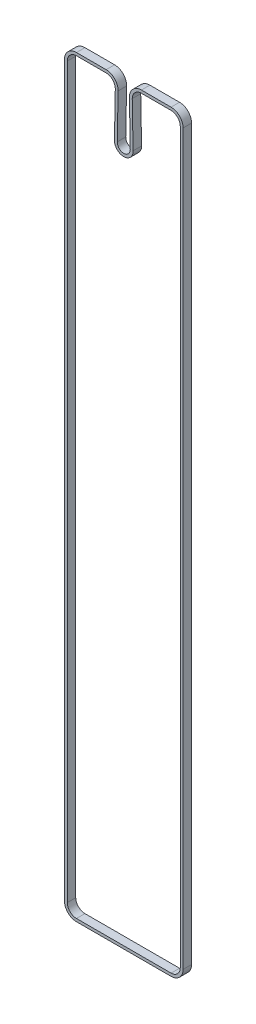
ISO-10303-21;
HEADER;
FILE_DESCRIPTION(('STEP AP214'),'2;1');
FILE_NAME('part.step','',(''),(''),'','','');
FILE_SCHEMA(('AUTOMOTIVE_DESIGN { 1 0 10303 214 1 1 1 1 }'));
ENDSEC;
DATA;
#1=APPLICATION_CONTEXT('core data for automotive mechanical design processes');
#2=APPLICATION_PROTOCOL_DEFINITION('international standard','automotive_design',2000,#1);
#3=PRODUCT_CONTEXT('',#1,'mechanical');
#4=PRODUCT('Part','Part','',(#3));
#5=PRODUCT_RELATED_PRODUCT_CATEGORY('part','',(#4));
#6=PRODUCT_DEFINITION_FORMATION('','',#4);
#7=PRODUCT_DEFINITION_CONTEXT('part definition',#1,'design');
#8=PRODUCT_DEFINITION('design','',#6,#7);
#9=PRODUCT_DEFINITION_SHAPE('','',#8);
#10=(LENGTH_UNIT() NAMED_UNIT(*) SI_UNIT(.MILLI.,.METRE.));
#11=(NAMED_UNIT(*) PLANE_ANGLE_UNIT() SI_UNIT($,.RADIAN.));
#12=(NAMED_UNIT(*) SI_UNIT($,.STERADIAN.) SOLID_ANGLE_UNIT());
#13=UNCERTAINTY_MEASURE_WITH_UNIT(LENGTH_MEASURE(1.E-05),#10,'distance_accuracy_value','');
#14=(GEOMETRIC_REPRESENTATION_CONTEXT(3) GLOBAL_UNCERTAINTY_ASSIGNED_CONTEXT((#13)) GLOBAL_UNIT_ASSIGNED_CONTEXT((#10,
#11,#12)) REPRESENTATION_CONTEXT('',''));
#15=CARTESIAN_POINT('',(0.,0.,0.));
#16=DIRECTION('',(0.,0.,1.));
#17=DIRECTION('',(1.,0.,0.));
#18=AXIS2_PLACEMENT_3D('',#15,#16,#17);
#19=CARTESIAN_POINT('',(-33.4999999570261,-122.865713415184,-0.600000235664039));
#20=DIRECTION('',(0.,0.,-1.));
#21=DIRECTION('',(-1.,0.,0.));
#22=AXIS2_PLACEMENT_3D('',#19,#20,#21);
#23=CYLINDRICAL_SURFACE('',#22,8.49999999999999);
#24=CARTESIAN_POINT('',(-33.4999999570261,-122.865713415184,-6.60000023566404));
#25=DIRECTION('',(0.,0.,1.));
#26=DIRECTION('',(1.,0.,0.));
#27=AXIS2_PLACEMENT_3D('',#24,#25,#26);
#28=CIRCLE('',#27,8.49999999999999);
#29=CARTESIAN_POINT('',(-33.4999999570261,-114.365713415184,-6.60000023566404));
#30=VERTEX_POINT('',#29);
#31=CARTESIAN_POINT('',(-41.9999999570261,-122.865713415184,-6.60000023566404));
#32=VERTEX_POINT('',#31);
#33=EDGE_CURVE('E239',#30,#32,#28,.T.);
#34=ORIENTED_EDGE('',*,*,#33,.T.);
#35=DIRECTION('',(0.,0.,-1.));
#36=VECTOR('',#35,1.);
#37=CARTESIAN_POINT('',(-41.9999999570261,-122.865713415184,-0.600000235664039));
#38=LINE('',#37,#36);
#39=CARTESIAN_POINT('',(-41.9999999570261,-122.865713415184,-0.600000235664039));
#40=VERTEX_POINT('',#39);
#41=EDGE_CURVE('E10',#40,#32,#38,.T.);
#42=ORIENTED_EDGE('',*,*,#41,.F.);
#43=CARTESIAN_POINT('',(-33.4999999570261,-122.865713415184,-0.600000235664039));
#44=DIRECTION('',(0.,0.,1.));
#45=DIRECTION('',(1.,0.,0.));
#46=AXIS2_PLACEMENT_3D('',#43,#44,#45);
#47=CIRCLE('',#46,8.49999999999999);
#48=CARTESIAN_POINT('',(-33.4999999570261,-114.365713415184,-0.600000235664039));
#49=VERTEX_POINT('',#48);
#50=EDGE_CURVE('E331',#49,#40,#47,.T.);
#51=ORIENTED_EDGE('',*,*,#50,.F.);
#52=DIRECTION('',(0.,0.,-1.));
#53=VECTOR('',#52,1.);
#54=CARTESIAN_POINT('',(-33.4999999570261,-114.365713415184,-0.600000235664039));
#55=LINE('',#54,#53);
#56=EDGE_CURVE('E354',#49,#30,#55,.T.);
#57=ORIENTED_EDGE('',*,*,#56,.T.);
#58=EDGE_LOOP('',(#34,#42,#51,#57));
#59=FACE_BOUND('',#58,.T.);
#60=ADVANCED_FACE('F15',(#59),#23,.T.);
#61=CARTESIAN_POINT('',(-41.9999999570261,-122.865713415184,-0.600000235664039));
#62=DIRECTION('',(1.,0.,0.));
#63=DIRECTION('',(0.,1.,0.));
#64=AXIS2_PLACEMENT_3D('',#61,#62,#63);
#65=PLANE('',#64);
#66=DIRECTION('',(0.,-1.,0.));
#67=VECTOR('',#66,1.);
#68=CARTESIAN_POINT('',(-41.9999999570261,-122.865713415184,-6.60000023566404));
#69=LINE('',#68,#67);
#70=CARTESIAN_POINT('',(-41.999999957026,-638.865713415184,-6.60000023566404));
#71=VERTEX_POINT('',#70);
#72=EDGE_CURVE('E235',#32,#71,#69,.T.);
#73=ORIENTED_EDGE('',*,*,#72,.T.);
#74=DIRECTION('',(0.,0.,-1.));
#75=VECTOR('',#74,1.);
#76=CARTESIAN_POINT('',(-41.999999957026,-638.865713415184,-0.600000235664039));
#77=LINE('',#76,#75);
#78=CARTESIAN_POINT('',(-41.999999957026,-638.865713415184,-0.600000235664039));
#79=VERTEX_POINT('',#78);
#80=EDGE_CURVE('E23',#79,#71,#77,.T.);
#81=ORIENTED_EDGE('',*,*,#80,.F.);
#82=DIRECTION('',(0.,-1.,0.));
#83=VECTOR('',#82,1.);
#84=CARTESIAN_POINT('',(-41.9999999570261,-122.865713415184,-0.600000235664039));
#85=LINE('',#84,#83);
#86=EDGE_CURVE('E129',#40,#79,#85,.T.);
#87=ORIENTED_EDGE('',*,*,#86,.F.);
#88=ORIENTED_EDGE('',*,*,#41,.T.);
#89=EDGE_LOOP('',(#73,#81,#87,#88));
#90=FACE_BOUND('',#89,.T.);
#91=ADVANCED_FACE('F482',(#90),#65,.F.);
#92=CARTESIAN_POINT('',(-33.499999957026,-638.865713415184,-0.600000235664039));
#93=DIRECTION('',(0.,0.,-1.));
#94=DIRECTION('',(-1.,0.,0.));
#95=AXIS2_PLACEMENT_3D('',#92,#93,#94);
#96=CYLINDRICAL_SURFACE('',#95,8.49999999999998);
#97=CARTESIAN_POINT('',(-33.499999957026,-638.865713415184,-6.60000023566404));
#98=DIRECTION('',(0.,0.,1.));
#99=DIRECTION('',(1.,0.,0.));
#100=AXIS2_PLACEMENT_3D('',#97,#98,#99);
#101=CIRCLE('',#100,8.49999999999998);
#102=CARTESIAN_POINT('',(-33.499999957026,-647.365713415184,-6.60000023566404));
#103=VERTEX_POINT('',#102);
#104=EDGE_CURVE('E238',#71,#103,#101,.T.);
#105=ORIENTED_EDGE('',*,*,#104,.T.);
#106=DIRECTION('',(0.,0.,-1.));
#107=VECTOR('',#106,1.);
#108=CARTESIAN_POINT('',(-33.499999957026,-647.365713415184,-0.600000235664039));
#109=LINE('',#108,#107);
#110=CARTESIAN_POINT('',(-33.499999957026,-647.365713415184,-0.600000235664039));
#111=VERTEX_POINT('',#110);
#112=EDGE_CURVE('E388',#111,#103,#109,.T.);
#113=ORIENTED_EDGE('',*,*,#112,.F.);
#114=CARTESIAN_POINT('',(-33.499999957026,-638.865713415184,-0.600000235664039));
#115=DIRECTION('',(0.,0.,1.));
#116=DIRECTION('',(1.,0.,0.));
#117=AXIS2_PLACEMENT_3D('',#114,#115,#116);
#118=CIRCLE('',#117,8.49999999999998);
#119=EDGE_CURVE('E396',#79,#111,#118,.T.);
#120=ORIENTED_EDGE('',*,*,#119,.F.);
#121=ORIENTED_EDGE('',*,*,#80,.T.);
#122=EDGE_LOOP('',(#105,#113,#120,#121));
#123=FACE_BOUND('',#122,.T.);
#124=ADVANCED_FACE('F394',(#123),#96,.T.);
#125=CARTESIAN_POINT('',(-33.499999957026,-647.365713415184,-0.600000235664039));
#126=DIRECTION('',(0.,1.,0.));
#127=DIRECTION('',(0.,0.,1.));
#128=AXIS2_PLACEMENT_3D('',#125,#126,#127);
#129=PLANE('',#128);
#130=DIRECTION('',(1.,0.,0.));
#131=VECTOR('',#130,1.);
#132=CARTESIAN_POINT('',(-33.499999957026,-647.365713415184,-6.60000023566404));
#133=LINE('',#132,#131);
#134=CARTESIAN_POINT('',(33.5000000429739,-647.365713415184,-6.60000023566404));
#135=VERTEX_POINT('',#134);
#136=EDGE_CURVE('E242',#103,#135,#133,.T.);
#137=ORIENTED_EDGE('',*,*,#136,.T.);
#138=DIRECTION('',(0.,0.,-1.));
#139=VECTOR('',#138,1.);
#140=CARTESIAN_POINT('',(33.5000000429739,-647.365713415184,-0.600000235664039));
#141=LINE('',#140,#139);
#142=CARTESIAN_POINT('',(33.5000000429739,-647.365713415184,-0.600000235664039));
#143=VERTEX_POINT('',#142);
#144=EDGE_CURVE('E385',#143,#135,#141,.T.);
#145=ORIENTED_EDGE('',*,*,#144,.F.);
#146=DIRECTION('',(1.,0.,0.));
#147=VECTOR('',#146,1.);
#148=CARTESIAN_POINT('',(-33.499999957026,-647.365713415184,-0.600000235664039));
#149=LINE('',#148,#147);
#150=EDGE_CURVE('E414',#111,#143,#149,.T.);
#151=ORIENTED_EDGE('',*,*,#150,.F.);
#152=ORIENTED_EDGE('',*,*,#112,.T.);
#153=EDGE_LOOP('',(#137,#145,#151,#152));
#154=FACE_BOUND('',#153,.T.);
#155=ADVANCED_FACE('F405',(#154),#129,.F.);
#156=CARTESIAN_POINT('',(33.5000000429739,-638.865713415184,-0.600000235664039));
#157=DIRECTION('',(0.,0.,-1.));
#158=DIRECTION('',(-1.,0.,0.));
#159=AXIS2_PLACEMENT_3D('',#156,#157,#158);
#160=CYLINDRICAL_SURFACE('',#159,8.49999999999994);
#161=CARTESIAN_POINT('',(33.5000000429739,-638.865713415184,-6.60000023566404));
#162=DIRECTION('',(0.,0.,1.));
#163=DIRECTION('',(-1.,0.,0.));
#164=AXIS2_PLACEMENT_3D('',#161,#162,#163);
#165=CIRCLE('',#164,8.49999999999994);
#166=CARTESIAN_POINT('',(42.0000000429738,-638.865713415184,-6.60000023566404));
#167=VERTEX_POINT('',#166);
#168=EDGE_CURVE('E245',#135,#167,#165,.T.);
#169=ORIENTED_EDGE('',*,*,#168,.T.);
#170=DIRECTION('',(0.,0.,-1.));
#171=VECTOR('',#170,1.);
#172=CARTESIAN_POINT('',(42.0000000429738,-638.865713415184,-0.600000235664039));
#173=LINE('',#172,#171);
#174=CARTESIAN_POINT('',(42.0000000429738,-638.865713415184,-0.600000235664039));
#175=VERTEX_POINT('',#174);
#176=EDGE_CURVE('E382',#175,#167,#173,.T.);
#177=ORIENTED_EDGE('',*,*,#176,.F.);
#178=CARTESIAN_POINT('',(33.5000000429739,-638.865713415184,-0.600000235664039));
#179=DIRECTION('',(0.,0.,1.));
#180=DIRECTION('',(-1.,0.,0.));
#181=AXIS2_PLACEMENT_3D('',#178,#179,#180);
#182=CIRCLE('',#181,8.49999999999994);
#183=EDGE_CURVE('E411',#143,#175,#182,.T.);
#184=ORIENTED_EDGE('',*,*,#183,.F.);
#185=ORIENTED_EDGE('',*,*,#144,.T.);
#186=EDGE_LOOP('',(#169,#177,#184,#185));
#187=FACE_BOUND('',#186,.T.);
#188=ADVANCED_FACE('F409',(#187),#160,.T.);
#189=CARTESIAN_POINT('',(42.0000000429741,-638.865713415184,-0.600000235664039));
#190=DIRECTION('',(-1.,0.,0.));
#191=DIRECTION('',(0.,-1.,0.));
#192=AXIS2_PLACEMENT_3D('',#189,#190,#191);
#193=PLANE('',#192);
#194=DIRECTION('',(0.,1.,0.));
#195=VECTOR('',#194,1.);
#196=CARTESIAN_POINT('',(42.0000000429741,-638.865713415184,-6.60000023566404));
#197=LINE('',#196,#195);
#198=CARTESIAN_POINT('',(42.0000000429742,-122.865713415184,-6.60000023566404));
#199=VERTEX_POINT('',#198);
#200=EDGE_CURVE('E248',#167,#199,#197,.T.);
#201=ORIENTED_EDGE('',*,*,#200,.T.);
#202=DIRECTION('',(0.,0.,-1.));
#203=VECTOR('',#202,1.);
#204=CARTESIAN_POINT('',(42.0000000429742,-122.865713415184,-0.600000235664039));
#205=LINE('',#204,#203);
#206=CARTESIAN_POINT('',(42.0000000429742,-122.865713415184,-0.600000235664039));
#207=VERTEX_POINT('',#206);
#208=EDGE_CURVE('E379',#207,#199,#205,.T.);
#209=ORIENTED_EDGE('',*,*,#208,.F.);
#210=DIRECTION('',(0.,1.,0.));
#211=VECTOR('',#210,1.);
#212=CARTESIAN_POINT('',(42.0000000429741,-638.865713415184,-0.600000235664039));
#213=LINE('',#212,#211);
#214=EDGE_CURVE('E413',#175,#207,#213,.T.);
#215=ORIENTED_EDGE('',*,*,#214,.F.);
#216=ORIENTED_EDGE('',*,*,#176,.T.);
#217=EDGE_LOOP('',(#201,#209,#215,#216));
#218=FACE_BOUND('',#217,.T.);
#219=ADVANCED_FACE('F529',(#218),#193,.F.);
#220=CARTESIAN_POINT('',(33.4999999182107,-122.865713415184,-0.600000235664039));
#221=DIRECTION('',(0.,0.,-1.));
#222=DIRECTION('',(-1.,0.,0.));
#223=AXIS2_PLACEMENT_3D('',#220,#221,#222);
#224=CYLINDRICAL_SURFACE('',#223,8.50000000000001);
#225=CARTESIAN_POINT('',(33.4999999182107,-122.865713415184,-6.60000023566404));
#226=DIRECTION('',(0.,0.,1.));
#227=DIRECTION('',(1.,0.,0.));
#228=AXIS2_PLACEMENT_3D('',#225,#226,#227);
#229=CIRCLE('',#228,8.50000000000001);
#230=CARTESIAN_POINT('',(33.4999999182107,-114.365713415184,-6.60000023566404));
#231=VERTEX_POINT('',#230);
#232=EDGE_CURVE('E251',#199,#231,#229,.T.);
#233=ORIENTED_EDGE('',*,*,#232,.T.);
#234=DIRECTION('',(0.,0.,-1.));
#235=VECTOR('',#234,1.);
#236=CARTESIAN_POINT('',(33.4999999182107,-114.365713415184,-0.600000235664039));
#237=LINE('',#236,#235);
#238=CARTESIAN_POINT('',(33.4999999182107,-114.365713415184,-0.600000235664039));
#239=VERTEX_POINT('',#238);
#240=EDGE_CURVE('E376',#239,#231,#237,.T.);
#241=ORIENTED_EDGE('',*,*,#240,.F.);
#242=CARTESIAN_POINT('',(33.4999999182107,-122.865713415184,-0.600000235664039));
#243=DIRECTION('',(0.,0.,1.));
#244=DIRECTION('',(1.,0.,0.));
#245=AXIS2_PLACEMENT_3D('',#242,#243,#244);
#246=CIRCLE('',#245,8.50000000000001);
#247=EDGE_CURVE('E416',#207,#239,#246,.T.);
#248=ORIENTED_EDGE('',*,*,#247,.F.);
#249=ORIENTED_EDGE('',*,*,#208,.T.);
#250=EDGE_LOOP('',(#233,#241,#248,#249));
#251=FACE_BOUND('',#250,.T.);
#252=ADVANCED_FACE('F526',(#251),#224,.T.);
#253=CARTESIAN_POINT('',(33.4999999182107,-114.365713415184,-0.600000235664039));
#254=DIRECTION('',(0.,-1.,0.));
#255=DIRECTION('',(1.,0.,0.));
#256=AXIS2_PLACEMENT_3D('',#253,#254,#255);
#257=PLANE('',#256);
#258=DIRECTION('',(-1.,0.,0.));
#259=VECTOR('',#258,1.);
#260=CARTESIAN_POINT('',(33.4999999182107,-114.365713415184,-6.60000023566404));
#261=LINE('',#260,#259);
#262=CARTESIAN_POINT('',(12.5000000429738,-114.365713415184,-6.60000023566404));
#263=VERTEX_POINT('',#262);
#264=EDGE_CURVE('E254',#231,#263,#261,.T.);
#265=ORIENTED_EDGE('',*,*,#264,.T.);
#266=DIRECTION('',(0.,0.,-1.));
#267=VECTOR('',#266,1.);
#268=CARTESIAN_POINT('',(12.5000000429738,-114.365713415184,-0.600000235664039));
#269=LINE('',#268,#267);
#270=CARTESIAN_POINT('',(12.5000000429738,-114.365713415184,-0.600000235664039));
#271=VERTEX_POINT('',#270);
#272=EDGE_CURVE('E373',#271,#263,#269,.T.);
#273=ORIENTED_EDGE('',*,*,#272,.F.);
#274=DIRECTION('',(-1.,0.,0.));
#275=VECTOR('',#274,1.);
#276=CARTESIAN_POINT('',(33.4999999182107,-114.365713415184,-0.600000235664039));
#277=LINE('',#276,#275);
#278=EDGE_CURVE('E422',#239,#271,#277,.T.);
#279=ORIENTED_EDGE('',*,*,#278,.F.);
#280=ORIENTED_EDGE('',*,*,#240,.T.);
#281=EDGE_LOOP('',(#265,#273,#279,#280));
#282=FACE_BOUND('',#281,.T.);
#283=ADVANCED_FACE('F521',(#282),#257,.F.);
#284=CARTESIAN_POINT('',(12.5000000429738,-122.865713415184,-0.600000235664039));
#285=DIRECTION('',(0.,0.,-1.));
#286=DIRECTION('',(-1.,0.,0.));
#287=AXIS2_PLACEMENT_3D('',#284,#285,#286);
#288=CYLINDRICAL_SURFACE('',#287,8.49999999999999);
#289=CARTESIAN_POINT('',(12.5000000429738,-122.865713415184,-6.60000023566404));
#290=DIRECTION('',(0.,0.,1.));
#291=DIRECTION('',(1.,0.,0.));
#292=AXIS2_PLACEMENT_3D('',#289,#290,#291);
#293=CIRCLE('',#292,8.49999999999999);
#294=CARTESIAN_POINT('',(4.00002358107674,-122.885717094731,-6.60000023566404));
#295=VERTEX_POINT('',#294);
#296=EDGE_CURVE('E257',#263,#295,#293,.T.);
#297=ORIENTED_EDGE('',*,*,#296,.T.);
#298=DIRECTION('',(0.,0.,-1.));
#299=VECTOR('',#298,1.);
#300=CARTESIAN_POINT('',(4.00002358107674,-122.885717094731,-0.600000235664039));
#301=LINE('',#300,#299);
#302=CARTESIAN_POINT('',(4.00002358107674,-122.885717094731,-0.600000235664039));
#303=VERTEX_POINT('',#302);
#304=EDGE_CURVE('E370',#303,#295,#301,.T.);
#305=ORIENTED_EDGE('',*,*,#304,.F.);
#306=CARTESIAN_POINT('',(12.5000000429738,-122.865713415184,-0.600000235664039));
#307=DIRECTION('',(0.,0.,1.));
#308=DIRECTION('',(1.,0.,0.));
#309=AXIS2_PLACEMENT_3D('',#306,#307,#308);
#310=CIRCLE('',#309,8.49999999999999);
#311=EDGE_CURVE('E424',#271,#303,#310,.T.);
#312=ORIENTED_EDGE('',*,*,#311,.F.);
#313=ORIENTED_EDGE('',*,*,#272,.T.);
#314=EDGE_LOOP('',(#297,#305,#312,#313));
#315=FACE_BOUND('',#314,.T.);
#316=ADVANCED_FACE('F516',(#315),#288,.T.);
#317=CARTESIAN_POINT('',(4.00002358107674,-122.885717094731,-0.600000235664039));
#318=DIRECTION('',(0.999824265973376,0.0187466575900997,0.));
#319=DIRECTION('',(-0.0187466575900997,0.999824265973376,0.));
#320=AXIS2_PLACEMENT_3D('',#317,#318,#319);
#321=PLANE('',#320);
#322=DIRECTION('',(0.0187466575900997,-0.999824265973376,0.));
#323=VECTOR('',#322,1.);
#324=CARTESIAN_POINT('',(4.00002358107674,-122.885717094731,-6.60000023566404));
#325=LINE('',#324,#323);
#326=CARTESIAN_POINT('',(4.59609412999186,-154.676226745483,-6.60000023566404));
#327=VERTEX_POINT('',#326);
#328=EDGE_CURVE('E260',#295,#327,#325,.T.);
#329=ORIENTED_EDGE('',*,*,#328,.T.);
#330=DIRECTION('',(0.,0.,-1.));
#331=VECTOR('',#330,1.);
#332=CARTESIAN_POINT('',(4.59609412999186,-154.676226745483,-0.600000235664039));
#333=LINE('',#332,#331);
#334=CARTESIAN_POINT('',(4.59609412999186,-154.676226745483,-0.600000235664039));
#335=VERTEX_POINT('',#334);
#336=EDGE_CURVE('E367',#335,#327,#333,.T.);
#337=ORIENTED_EDGE('',*,*,#336,.F.);
#338=DIRECTION('',(0.0187466575900997,-0.999824265973376,0.));
#339=VECTOR('',#338,1.);
#340=CARTESIAN_POINT('',(4.00002358107674,-122.885717094731,-0.600000235664039));
#341=LINE('',#340,#339);
#342=EDGE_CURVE('E426',#303,#335,#341,.T.);
#343=ORIENTED_EDGE('',*,*,#342,.F.);
#344=ORIENTED_EDGE('',*,*,#304,.T.);
#345=EDGE_LOOP('',(#329,#337,#343,#344));
#346=FACE_BOUND('',#345,.T.);
#347=ADVANCED_FACE('F512',(#346),#321,.F.);
#348=CARTESIAN_POINT('',(-1.47410572588655E-06,-154.865713415185,-0.600000235664039));
#349=DIRECTION('',(0.,0.,-1.));
#350=DIRECTION('',(-1.,0.,0.));
#351=AXIS2_PLACEMENT_3D('',#348,#349,#350);
#352=CYLINDRICAL_SURFACE('',#351,4.6);
#353=CARTESIAN_POINT('',(-1.47410572588655E-06,-154.865713415185,-6.60000023566404));
#354=DIRECTION('',(0.,0.,-1.));
#355=DIRECTION('',(0.,1.,0.));
#356=AXIS2_PLACEMENT_3D('',#353,#354,#355);
#357=CIRCLE('',#356,4.6);
#358=CARTESIAN_POINT('',(-4.59609704035218,-154.676225827387,-6.60000023566404));
#359=VERTEX_POINT('',#358);
#360=EDGE_CURVE('E263',#327,#359,#357,.T.);
#361=ORIENTED_EDGE('',*,*,#360,.T.);
#362=DIRECTION('',(0.,0.,-1.));
#363=VECTOR('',#362,1.);
#364=CARTESIAN_POINT('',(-4.59609704035218,-154.676225827387,-0.600000235664039));
#365=LINE('',#364,#363);
#366=CARTESIAN_POINT('',(-4.59609704035218,-154.676225827387,-0.600000235664039));
#367=VERTEX_POINT('',#366);
#368=EDGE_CURVE('E364',#367,#359,#365,.T.);
#369=ORIENTED_EDGE('',*,*,#368,.F.);
#370=CARTESIAN_POINT('',(-1.47410572588655E-06,-154.865713415185,-0.600000235664039));
#371=DIRECTION('',(0.,0.,-1.));
#372=DIRECTION('',(0.,1.,0.));
#373=AXIS2_PLACEMENT_3D('',#370,#371,#372);
#374=CIRCLE('',#373,4.6);
#375=EDGE_CURVE('E428',#335,#367,#374,.T.);
#376=ORIENTED_EDGE('',*,*,#375,.F.);
#377=ORIENTED_EDGE('',*,*,#336,.T.);
#378=EDGE_LOOP('',(#361,#369,#376,#377));
#379=FACE_BOUND('',#378,.T.);
#380=ADVANCED_FACE('F507',(#379),#352,.F.);
#381=CARTESIAN_POINT('',(-4.59609704035218,-154.676225827387,-0.600000235664039));
#382=DIRECTION('',(-0.999824264269616,0.0187467484573083,0.));
#383=DIRECTION('',(-0.0187467484573083,-0.999824264269616,0.));
#384=AXIS2_PLACEMENT_3D('',#381,#382,#383);
#385=PLANE('',#384);
#386=DIRECTION('',(0.0187467484573083,0.999824264269616,0.));
#387=VECTOR('',#386,1.);
#388=CARTESIAN_POINT('',(-4.59609704035218,-154.676225827387,-6.60000023566404));
#389=LINE('',#388,#387);
#390=CARTESIAN_POINT('',(-4.00524821390532,-123.16436154105,-6.60000023566404));
#391=VERTEX_POINT('',#390);
#392=EDGE_CURVE('E266',#359,#391,#389,.T.);
#393=ORIENTED_EDGE('',*,*,#392,.T.);
#394=DIRECTION('',(0.,0.,-1.));
#395=VECTOR('',#394,1.);
#396=CARTESIAN_POINT('',(-4.00524821390532,-123.16436154105,-0.600000235664039));
#397=LINE('',#396,#395);
#398=CARTESIAN_POINT('',(-4.00524821390532,-123.16436154105,-0.600000235664039));
#399=VERTEX_POINT('',#398);
#400=EDGE_CURVE('E361',#399,#391,#397,.T.);
#401=ORIENTED_EDGE('',*,*,#400,.F.);
#402=DIRECTION('',(0.0187467484573083,0.999824264269616,0.));
#403=VECTOR('',#402,1.);
#404=CARTESIAN_POINT('',(-4.59609704035218,-154.676225827387,-0.600000235664039));
#405=LINE('',#404,#403);
#406=EDGE_CURVE('E430',#367,#399,#405,.T.);
#407=ORIENTED_EDGE('',*,*,#406,.F.);
#408=ORIENTED_EDGE('',*,*,#368,.T.);
#409=EDGE_LOOP('',(#393,#401,#407,#408));
#410=FACE_BOUND('',#409,.T.);
#411=ADVANCED_FACE('F501',(#410),#385,.F.);
#412=CARTESIAN_POINT('',(-12.5000000817892,-122.865713415184,-0.600000235664039));
#413=DIRECTION('',(0.,0.,-1.));
#414=DIRECTION('',(-1.,0.,0.));
#415=AXIS2_PLACEMENT_3D('',#412,#413,#414);
#416=CYLINDRICAL_SURFACE('',#415,8.49999999999999);
#417=CARTESIAN_POINT('',(-12.5000000817892,-122.865713415184,-6.60000023566404));
#418=DIRECTION('',(0.,0.,1.));
#419=DIRECTION('',(-1.,0.,0.));
#420=AXIS2_PLACEMENT_3D('',#417,#418,#419);
#421=CIRCLE('',#420,8.49999999999999);
#422=CARTESIAN_POINT('',(-12.5000000817892,-114.365713415184,-6.60000023566404));
#423=VERTEX_POINT('',#422);
#424=EDGE_CURVE('E269',#391,#423,#421,.T.);
#425=ORIENTED_EDGE('',*,*,#424,.T.);
#426=DIRECTION('',(0.,0.,-1.));
#427=VECTOR('',#426,1.);
#428=CARTESIAN_POINT('',(-12.5000000817892,-114.365713415184,-0.600000235664039));
#429=LINE('',#428,#427);
#430=CARTESIAN_POINT('',(-12.5000000817892,-114.365713415184,-0.600000235664039));
#431=VERTEX_POINT('',#430);
#432=EDGE_CURVE('E358',#431,#423,#429,.T.);
#433=ORIENTED_EDGE('',*,*,#432,.F.);
#434=CARTESIAN_POINT('',(-12.5000000817892,-122.865713415184,-0.600000235664039));
#435=DIRECTION('',(0.,0.,1.));
#436=DIRECTION('',(-1.,0.,0.));
#437=AXIS2_PLACEMENT_3D('',#434,#435,#436);
#438=CIRCLE('',#437,8.49999999999999);
#439=EDGE_CURVE('E432',#399,#431,#438,.T.);
#440=ORIENTED_EDGE('',*,*,#439,.F.);
#441=ORIENTED_EDGE('',*,*,#400,.T.);
#442=EDGE_LOOP('',(#425,#433,#440,#441));
#443=FACE_BOUND('',#442,.T.);
#444=ADVANCED_FACE('F497',(#443),#416,.T.);
#445=CARTESIAN_POINT('',(-33.4999999570261,-122.865713415184,-0.600000235664039));
#446=DIRECTION('',(0.,0.,-1.));
#447=DIRECTION('',(-1.,0.,0.));
#448=AXIS2_PLACEMENT_3D('',#445,#446,#447);
#449=CYLINDRICAL_SURFACE('',#448,6.49999999999999);
#450=CARTESIAN_POINT('',(-33.4999999570261,-122.865713415184,-6.60000023566404));
#451=DIRECTION('',(0.,0.,1.));
#452=DIRECTION('',(1.,0.,0.));
#453=AXIS2_PLACEMENT_3D('',#450,#451,#452);
#454=CIRCLE('',#453,6.49999999999999);
#455=CARTESIAN_POINT('',(-33.4999999570261,-116.365713415184,-6.60000023566404));
#456=VERTEX_POINT('',#455);
#457=CARTESIAN_POINT('',(-39.9999999570261,-122.865713415184,-6.60000023566404));
#458=VERTEX_POINT('',#457);
#459=EDGE_CURVE('E327',#456,#458,#454,.T.);
#460=ORIENTED_EDGE('',*,*,#459,.F.);
#461=DIRECTION('',(0.,0.,-1.));
#462=VECTOR('',#461,1.);
#463=CARTESIAN_POINT('',(-33.4999999570261,-116.365713415184,-0.600000235664039));
#464=LINE('',#463,#462);
#465=CARTESIAN_POINT('',(-33.4999999570261,-116.365713415184,-0.600000235664039));
#466=VERTEX_POINT('',#465);
#467=EDGE_CURVE('E352',#466,#456,#464,.T.);
#468=ORIENTED_EDGE('',*,*,#467,.F.);
#469=CARTESIAN_POINT('',(-33.4999999570261,-122.865713415184,-0.600000235664039));
#470=DIRECTION('',(0.,0.,1.));
#471=DIRECTION('',(1.,0.,0.));
#472=AXIS2_PLACEMENT_3D('',#469,#470,#471);
#473=CIRCLE('',#472,6.49999999999999);
#474=CARTESIAN_POINT('',(-39.9999999570261,-122.865713415184,-0.600000235664039));
#475=VERTEX_POINT('',#474);
#476=EDGE_CURVE('E230',#466,#475,#473,.T.);
#477=ORIENTED_EDGE('',*,*,#476,.T.);
#478=DIRECTION('',(0.,0.,-1.));
#479=VECTOR('',#478,1.);
#480=CARTESIAN_POINT('',(-39.9999999570261,-122.865713415184,-0.600000235664039));
#481=LINE('',#480,#479);
#482=EDGE_CURVE('E31',#475,#458,#481,.T.);
#483=ORIENTED_EDGE('',*,*,#482,.T.);
#484=EDGE_LOOP('',(#460,#468,#477,#483));
#485=FACE_BOUND('',#484,.T.);
#486=ADVANCED_FACE('F537',(#485),#449,.F.);
#487=CARTESIAN_POINT('',(-12.5000000817892,-116.365713415184,-0.600000235664039));
#488=DIRECTION('',(0.,-1.,0.));
#489=DIRECTION('',(0.,0.,-1.));
#490=AXIS2_PLACEMENT_3D('',#487,#488,#489);
#491=PLANE('',#490);
#492=DIRECTION('',(-1.,0.,0.));
#493=VECTOR('',#492,1.);
#494=CARTESIAN_POINT('',(-12.5000000817892,-116.365713415184,-6.60000023566404));
#495=LINE('',#494,#493);
#496=CARTESIAN_POINT('',(-12.5000000817892,-116.365713415184,-6.60000023566404));
#497=VERTEX_POINT('',#496);
#498=EDGE_CURVE('E275',#497,#456,#495,.T.);
#499=ORIENTED_EDGE('',*,*,#498,.F.);
#500=DIRECTION('',(0.,0.,-1.));
#501=VECTOR('',#500,1.);
#502=CARTESIAN_POINT('',(-12.5000000817892,-116.365713415184,-0.600000235664039));
#503=LINE('',#502,#501);
#504=CARTESIAN_POINT('',(-12.5000000817892,-116.365713415184,-0.600000235664039));
#505=VERTEX_POINT('',#504);
#506=EDGE_CURVE('E351',#505,#497,#503,.T.);
#507=ORIENTED_EDGE('',*,*,#506,.F.);
#508=DIRECTION('',(-1.,0.,0.));
#509=VECTOR('',#508,1.);
#510=CARTESIAN_POINT('',(-12.5000000817892,-116.365713415184,-0.600000235664039));
#511=LINE('',#510,#509);
#512=EDGE_CURVE('E436',#505,#466,#511,.T.);
#513=ORIENTED_EDGE('',*,*,#512,.T.);
#514=ORIENTED_EDGE('',*,*,#467,.T.);
#515=EDGE_LOOP('',(#499,#507,#513,#514));
#516=FACE_BOUND('',#515,.T.);
#517=ADVANCED_FACE('F539',(#516),#491,.T.);
#518=CARTESIAN_POINT('',(-12.5000000817892,-122.865713415184,-0.600000235664039));
#519=DIRECTION('',(0.,0.,-1.));
#520=DIRECTION('',(-1.,0.,0.));
#521=AXIS2_PLACEMENT_3D('',#518,#519,#520);
#522=CYLINDRICAL_SURFACE('',#521,6.49999999999999);
#523=CARTESIAN_POINT('',(-12.5000000817892,-122.865713415184,-6.60000023566404));
#524=DIRECTION('',(0.,0.,1.));
#525=DIRECTION('',(-1.,0.,0.));
#526=AXIS2_PLACEMENT_3D('',#523,#524,#525);
#527=CIRCLE('',#526,6.49999999999999);
#528=CARTESIAN_POINT('',(-6.00456880929899,-123.109378316957,-6.60000023566404));
#529=VERTEX_POINT('',#528);
#530=EDGE_CURVE('E282',#529,#497,#527,.T.);
#531=ORIENTED_EDGE('',*,*,#530,.F.);
#532=DIRECTION('',(0.,0.,-1.));
#533=VECTOR('',#532,1.);
#534=CARTESIAN_POINT('',(-6.00456880929899,-123.109378316957,-0.600000235664039));
#535=LINE('',#534,#533);
#536=CARTESIAN_POINT('',(-6.00456880929899,-123.109378316957,-0.600000235664039));
#537=VERTEX_POINT('',#536);
#538=EDGE_CURVE('E349',#537,#529,#535,.T.);
#539=ORIENTED_EDGE('',*,*,#538,.F.);
#540=CARTESIAN_POINT('',(-12.5000000817892,-122.865713415184,-0.600000235664039));
#541=DIRECTION('',(0.,0.,1.));
#542=DIRECTION('',(-1.,0.,0.));
#543=AXIS2_PLACEMENT_3D('',#540,#541,#542);
#544=CIRCLE('',#543,6.49999999999999);
#545=EDGE_CURVE('E440',#537,#505,#544,.T.);
#546=ORIENTED_EDGE('',*,*,#545,.T.);
#547=ORIENTED_EDGE('',*,*,#506,.T.);
#548=EDGE_LOOP('',(#531,#539,#546,#547));
#549=FACE_BOUND('',#548,.T.);
#550=ADVANCED_FACE('F544',(#549),#522,.F.);
#551=CARTESIAN_POINT('',(-6.59536245847977,-154.618299822598,-0.600000235664039));
#552=DIRECTION('',(-0.999824264269616,0.0187467484573083,0.));
#553=DIRECTION('',(-0.0187467484573083,-0.999824264269616,0.));
#554=AXIS2_PLACEMENT_3D('',#551,#552,#553);
#555=PLANE('',#554);
#556=DIRECTION('',(0.0187467484573083,0.999824264269616,0.));
#557=VECTOR('',#556,1.);
#558=CARTESIAN_POINT('',(-6.59536245847977,-154.618299822598,-6.60000023566404));
#559=LINE('',#558,#557);
#560=CARTESIAN_POINT('',(-6.59536245847976,-154.618299822598,-6.60000023566404));
#561=VERTEX_POINT('',#560);
#562=EDGE_CURVE('E286',#561,#529,#559,.T.);
#563=ORIENTED_EDGE('',*,*,#562,.F.);
#564=DIRECTION('',(0.,0.,-1.));
#565=VECTOR('',#564,1.);
#566=CARTESIAN_POINT('',(-6.59536245847976,-154.618299822598,-0.600000235664039));
#567=LINE('',#566,#565);
#568=CARTESIAN_POINT('',(-6.59536245847976,-154.618299822598,-0.600000235664039));
#569=VERTEX_POINT('',#568);
#570=EDGE_CURVE('E347',#569,#561,#567,.T.);
#571=ORIENTED_EDGE('',*,*,#570,.F.);
#572=DIRECTION('',(0.0187467484573083,0.999824264269616,0.));
#573=VECTOR('',#572,1.);
#574=CARTESIAN_POINT('',(-6.59536245847977,-154.618299822598,-0.600000235664039));
#575=LINE('',#574,#573);
#576=EDGE_CURVE('E443',#569,#537,#575,.T.);
#577=ORIENTED_EDGE('',*,*,#576,.T.);
#578=ORIENTED_EDGE('',*,*,#538,.T.);
#579=EDGE_LOOP('',(#563,#571,#577,#578));
#580=FACE_BOUND('',#579,.T.);
#581=ADVANCED_FACE('F556',(#580),#555,.T.);
#582=CARTESIAN_POINT('',(-1.47410572588655E-06,-154.865713415185,-0.600000235664039));
#583=DIRECTION('',(0.,0.,-1.));
#584=DIRECTION('',(-1.,0.,0.));
#585=AXIS2_PLACEMENT_3D('',#582,#583,#584);
#586=CYLINDRICAL_SURFACE('',#585,6.6);
#587=CARTESIAN_POINT('',(-1.47410572588655E-06,-154.865713415185,-6.60000023566404));
#588=DIRECTION('',(0.,0.,-1.));
#589=DIRECTION('',(0.,1.,0.));
#590=AXIS2_PLACEMENT_3D('',#587,#588,#589);
#591=CIRCLE('',#590,6.6);
#592=CARTESIAN_POINT('',(6.5953595552414,-154.618301021459,-6.60000023566404));
#593=VERTEX_POINT('',#592);
#594=EDGE_CURVE('E290',#593,#561,#591,.T.);
#595=ORIENTED_EDGE('',*,*,#594,.F.);
#596=DIRECTION('',(0.,0.,-1.));
#597=VECTOR('',#596,1.);
#598=CARTESIAN_POINT('',(6.5953595552414,-154.618301021459,-0.600000235664039));
#599=LINE('',#598,#597);
#600=CARTESIAN_POINT('',(6.5953595552414,-154.618301021459,-0.600000235664039));
#601=VERTEX_POINT('',#600);
#602=EDGE_CURVE('E345',#601,#593,#599,.T.);
#603=ORIENTED_EDGE('',*,*,#602,.F.);
#604=CARTESIAN_POINT('',(-1.47410572588655E-06,-154.865713415185,-0.600000235664039));
#605=DIRECTION('',(0.,0.,-1.));
#606=DIRECTION('',(0.,1.,0.));
#607=AXIS2_PLACEMENT_3D('',#604,#605,#606);
#608=CIRCLE('',#607,6.6);
#609=EDGE_CURVE('E446',#601,#569,#608,.T.);
#610=ORIENTED_EDGE('',*,*,#609,.T.);
#611=ORIENTED_EDGE('',*,*,#570,.T.);
#612=EDGE_LOOP('',(#595,#603,#610,#611));
#613=FACE_BOUND('',#612,.T.);
#614=ADVANCED_FACE('F561',(#613),#586,.T.);
#615=CARTESIAN_POINT('',(6.5953595552414,-154.618301021459,-0.600000235664039));
#616=DIRECTION('',(0.999824265973376,0.0187466575900997,0.));
#617=DIRECTION('',(-0.0187466575900997,0.999824265973376,0.));
#618=AXIS2_PLACEMENT_3D('',#615,#616,#617);
#619=PLANE('',#618);
#620=DIRECTION('',(0.0187466575900997,-0.999824265973376,0.));
#621=VECTOR('',#620,1.);
#622=CARTESIAN_POINT('',(6.5953595552414,-154.618301021459,-6.60000023566404));
#623=LINE('',#622,#621);
#624=CARTESIAN_POINT('',(6.00000004297383,-122.865713421121,-6.60000023566404));
#625=VERTEX_POINT('',#624);
#626=EDGE_CURVE('E294',#625,#593,#623,.T.);
#627=ORIENTED_EDGE('',*,*,#626,.F.);
#628=DIRECTION('',(0.,0.,-1.));
#629=VECTOR('',#628,1.);
#630=CARTESIAN_POINT('',(6.00000004297383,-122.865713421121,-0.600000235664039));
#631=LINE('',#630,#629);
#632=CARTESIAN_POINT('',(6.00000004297383,-122.865713421121,-0.600000235664039));
#633=VERTEX_POINT('',#632);
#634=EDGE_CURVE('E343',#633,#625,#631,.T.);
#635=ORIENTED_EDGE('',*,*,#634,.F.);
#636=DIRECTION('',(0.0187466575900997,-0.999824265973376,0.));
#637=VECTOR('',#636,1.);
#638=CARTESIAN_POINT('',(6.5953595552414,-154.618301021459,-0.600000235664039));
#639=LINE('',#638,#637);
#640=EDGE_CURVE('E449',#633,#601,#639,.T.);
#641=ORIENTED_EDGE('',*,*,#640,.T.);
#642=ORIENTED_EDGE('',*,*,#602,.T.);
#643=EDGE_LOOP('',(#627,#635,#641,#642));
#644=FACE_BOUND('',#643,.T.);
#645=ADVANCED_FACE('F564',(#644),#619,.T.);
#646=CARTESIAN_POINT('',(12.5000000429738,-122.865713415184,-0.600000235664039));
#647=DIRECTION('',(0.,0.,-1.));
#648=DIRECTION('',(-1.,0.,0.));
#649=AXIS2_PLACEMENT_3D('',#646,#647,#648);
#650=CYLINDRICAL_SURFACE('',#649,6.49999999999999);
#651=CARTESIAN_POINT('',(12.5000000429738,-122.865713415184,-6.60000023566404));
#652=DIRECTION('',(0.,0.,1.));
#653=DIRECTION('',(1.,0.,0.));
#654=AXIS2_PLACEMENT_3D('',#651,#652,#653);
#655=CIRCLE('',#654,6.49999999999999);
#656=CARTESIAN_POINT('',(12.5000000429738,-116.365713415184,-6.60000023566404));
#657=VERTEX_POINT('',#656);
#658=EDGE_CURVE('E298',#657,#625,#655,.T.);
#659=ORIENTED_EDGE('',*,*,#658,.F.);
#660=DIRECTION('',(0.,0.,-1.));
#661=VECTOR('',#660,1.);
#662=CARTESIAN_POINT('',(12.5000000429738,-116.365713415184,-0.600000235664039));
#663=LINE('',#662,#661);
#664=CARTESIAN_POINT('',(12.5000000429738,-116.365713415184,-0.600000235664039));
#665=VERTEX_POINT('',#664);
#666=EDGE_CURVE('E341',#665,#657,#663,.T.);
#667=ORIENTED_EDGE('',*,*,#666,.F.);
#668=CARTESIAN_POINT('',(12.5000000429738,-122.865713415184,-0.600000235664039));
#669=DIRECTION('',(0.,0.,1.));
#670=DIRECTION('',(1.,0.,0.));
#671=AXIS2_PLACEMENT_3D('',#668,#669,#670);
#672=CIRCLE('',#671,6.49999999999999);
#673=EDGE_CURVE('E452',#665,#633,#672,.T.);
#674=ORIENTED_EDGE('',*,*,#673,.T.);
#675=ORIENTED_EDGE('',*,*,#634,.T.);
#676=EDGE_LOOP('',(#659,#667,#674,#675));
#677=FACE_BOUND('',#676,.T.);
#678=ADVANCED_FACE('F569',(#677),#650,.F.);
#679=CARTESIAN_POINT('',(33.4999999182107,-116.365713415184,-0.600000235664039));
#680=DIRECTION('',(0.,-1.,0.));
#681=DIRECTION('',(1.,0.,0.));
#682=AXIS2_PLACEMENT_3D('',#679,#680,#681);
#683=PLANE('',#682);
#684=DIRECTION('',(-1.,0.,0.));
#685=VECTOR('',#684,1.);
#686=CARTESIAN_POINT('',(33.4999999182107,-116.365713415184,-6.60000023566404));
#687=LINE('',#686,#685);
#688=CARTESIAN_POINT('',(33.4999999182107,-116.365713415184,-6.60000023566404));
#689=VERTEX_POINT('',#688);
#690=EDGE_CURVE('E302',#689,#657,#687,.T.);
#691=ORIENTED_EDGE('',*,*,#690,.F.);
#692=DIRECTION('',(0.,0.,-1.));
#693=VECTOR('',#692,1.);
#694=CARTESIAN_POINT('',(33.4999999182107,-116.365713415184,-0.600000235664039));
#695=LINE('',#694,#693);
#696=CARTESIAN_POINT('',(33.4999999182107,-116.365713415184,-0.600000235664039));
#697=VERTEX_POINT('',#696);
#698=EDGE_CURVE('E339',#697,#689,#695,.T.);
#699=ORIENTED_EDGE('',*,*,#698,.F.);
#700=DIRECTION('',(-1.,0.,0.));
#701=VECTOR('',#700,1.);
#702=CARTESIAN_POINT('',(33.4999999182107,-116.365713415184,-0.600000235664039));
#703=LINE('',#702,#701);
#704=EDGE_CURVE('E455',#697,#665,#703,.T.);
#705=ORIENTED_EDGE('',*,*,#704,.T.);
#706=ORIENTED_EDGE('',*,*,#666,.T.);
#707=EDGE_LOOP('',(#691,#699,#705,#706));
#708=FACE_BOUND('',#707,.T.);
#709=ADVANCED_FACE('F572',(#708),#683,.T.);
#710=CARTESIAN_POINT('',(33.4999999182107,-122.865713415184,-0.600000235664039));
#711=DIRECTION('',(0.,0.,-1.));
#712=DIRECTION('',(-1.,0.,0.));
#713=AXIS2_PLACEMENT_3D('',#710,#711,#712);
#714=CYLINDRICAL_SURFACE('',#713,6.50000000000001);
#715=CARTESIAN_POINT('',(33.4999999182107,-122.865713415184,-6.60000023566404));
#716=DIRECTION('',(0.,0.,1.));
#717=DIRECTION('',(-1.,0.,0.));
#718=AXIS2_PLACEMENT_3D('',#715,#716,#717);
#719=CIRCLE('',#718,6.50000000000001);
#720=CARTESIAN_POINT('',(39.9999999182107,-122.865713415184,-6.60000023566404));
#721=VERTEX_POINT('',#720);
#722=EDGE_CURVE('E306',#721,#689,#719,.T.);
#723=ORIENTED_EDGE('',*,*,#722,.F.);
#724=DIRECTION('',(0.,0.,-1.));
#725=VECTOR('',#724,1.);
#726=CARTESIAN_POINT('',(39.9999999182107,-122.865713415184,-0.600000235664039));
#727=LINE('',#726,#725);
#728=CARTESIAN_POINT('',(39.9999999182107,-122.865713415184,-0.600000235664039));
#729=VERTEX_POINT('',#728);
#730=EDGE_CURVE('E337',#729,#721,#727,.T.);
#731=ORIENTED_EDGE('',*,*,#730,.F.);
#732=CARTESIAN_POINT('',(33.4999999182107,-122.865713415184,-0.600000235664039));
#733=DIRECTION('',(0.,0.,1.));
#734=DIRECTION('',(-1.,0.,0.));
#735=AXIS2_PLACEMENT_3D('',#732,#733,#734);
#736=CIRCLE('',#735,6.50000000000001);
#737=EDGE_CURVE('E458',#729,#697,#736,.T.);
#738=ORIENTED_EDGE('',*,*,#737,.T.);
#739=ORIENTED_EDGE('',*,*,#698,.T.);
#740=EDGE_LOOP('',(#723,#731,#738,#739));
#741=FACE_BOUND('',#740,.T.);
#742=ADVANCED_FACE('F576',(#741),#714,.F.);
#743=CARTESIAN_POINT('',(40.0000000429741,-638.865713415184,-0.600000235664039));
#744=DIRECTION('',(-1.,-2.4178956371532E-10,0.));
#745=DIRECTION('',(2.4178956371532E-10,-1.,0.));
#746=AXIS2_PLACEMENT_3D('',#743,#744,#745);
#747=PLANE('',#746);
#748=DIRECTION('',(-2.4178956371532E-10,1.,0.));
#749=VECTOR('',#748,1.);
#750=CARTESIAN_POINT('',(40.0000000429741,-638.865713415184,-6.60000023566404));
#751=LINE('',#750,#749);
#752=CARTESIAN_POINT('',(40.0000000429738,-638.865713415184,-6.60000023566404));
#753=VERTEX_POINT('',#752);
#754=EDGE_CURVE('E310',#753,#721,#751,.T.);
#755=ORIENTED_EDGE('',*,*,#754,.F.);
#756=DIRECTION('',(0.,0.,-1.));
#757=VECTOR('',#756,1.);
#758=CARTESIAN_POINT('',(40.0000000429738,-638.865713415184,-0.600000235664039));
#759=LINE('',#758,#757);
#760=CARTESIAN_POINT('',(40.0000000429738,-638.865713415184,-0.600000235664039));
#761=VERTEX_POINT('',#760);
#762=EDGE_CURVE('E335',#761,#753,#759,.T.);
#763=ORIENTED_EDGE('',*,*,#762,.F.);
#764=DIRECTION('',(-2.4178956371532E-10,1.,0.));
#765=VECTOR('',#764,1.);
#766=CARTESIAN_POINT('',(40.0000000429741,-638.865713415184,-0.600000235664039));
#767=LINE('',#766,#765);
#768=EDGE_CURVE('E461',#761,#729,#767,.T.);
#769=ORIENTED_EDGE('',*,*,#768,.T.);
#770=ORIENTED_EDGE('',*,*,#730,.T.);
#771=EDGE_LOOP('',(#755,#763,#769,#770));
#772=FACE_BOUND('',#771,.T.);
#773=ADVANCED_FACE('F578',(#772),#747,.T.);
#774=CARTESIAN_POINT('',(33.5000000429739,-638.865713415184,-0.600000235664039));
#775=DIRECTION('',(0.,0.,-1.));
#776=DIRECTION('',(-1.,0.,0.));
#777=AXIS2_PLACEMENT_3D('',#774,#775,#776);
#778=CYLINDRICAL_SURFACE('',#777,6.49999999999994);
#779=CARTESIAN_POINT('',(33.5000000429739,-638.865713415184,-6.60000023566404));
#780=DIRECTION('',(0.,0.,1.));
#781=DIRECTION('',(-1.,0.,0.));
#782=AXIS2_PLACEMENT_3D('',#779,#780,#781);
#783=CIRCLE('',#782,6.49999999999994);
#784=CARTESIAN_POINT('',(33.5000000429739,-645.365713415184,-6.60000023566404));
#785=VERTEX_POINT('',#784);
#786=EDGE_CURVE('E314',#785,#753,#783,.T.);
#787=ORIENTED_EDGE('',*,*,#786,.F.);
#788=DIRECTION('',(0.,0.,-1.));
#789=VECTOR('',#788,1.);
#790=CARTESIAN_POINT('',(33.5000000429739,-645.365713415184,-0.600000235664039));
#791=LINE('',#790,#789);
#792=CARTESIAN_POINT('',(33.5000000429739,-645.365713415184,-0.600000235664039));
#793=VERTEX_POINT('',#792);
#794=EDGE_CURVE('E214',#793,#785,#791,.T.);
#795=ORIENTED_EDGE('',*,*,#794,.F.);
#796=CARTESIAN_POINT('',(33.5000000429739,-638.865713415184,-0.600000235664039));
#797=DIRECTION('',(0.,0.,1.));
#798=DIRECTION('',(-1.,0.,0.));
#799=AXIS2_PLACEMENT_3D('',#796,#797,#798);
#800=CIRCLE('',#799,6.49999999999994);
#801=EDGE_CURVE('E225',#793,#761,#800,.T.);
#802=ORIENTED_EDGE('',*,*,#801,.T.);
#803=ORIENTED_EDGE('',*,*,#762,.T.);
#804=EDGE_LOOP('',(#787,#795,#802,#803));
#805=FACE_BOUND('',#804,.T.);
#806=ADVANCED_FACE('F465',(#805),#778,.F.);
#807=CARTESIAN_POINT('',(-33.499999957026,-645.365713415184,-0.600000235664039));
#808=DIRECTION('',(0.,1.,0.));
#809=DIRECTION('',(-1.,0.,0.));
#810=AXIS2_PLACEMENT_3D('',#807,#808,#809);
#811=PLANE('',#810);
#812=DIRECTION('',(1.,0.,0.));
#813=VECTOR('',#812,1.);
#814=CARTESIAN_POINT('',(-33.499999957026,-645.365713415184,-6.60000023566404));
#815=LINE('',#814,#813);
#816=CARTESIAN_POINT('',(-33.499999957026,-645.365713415184,-6.60000023566404));
#817=VERTEX_POINT('',#816);
#818=EDGE_CURVE('E210',#817,#785,#815,.T.);
#819=ORIENTED_EDGE('',*,*,#818,.F.);
#820=DIRECTION('',(0.,0.,-1.));
#821=VECTOR('',#820,1.);
#822=CARTESIAN_POINT('',(-33.499999957026,-645.365713415184,-0.600000235664039));
#823=LINE('',#822,#821);
#824=CARTESIAN_POINT('',(-33.499999957026,-645.365713415184,-0.600000235664039));
#825=VERTEX_POINT('',#824);
#826=EDGE_CURVE('E205',#825,#817,#823,.T.);
#827=ORIENTED_EDGE('',*,*,#826,.F.);
#828=DIRECTION('',(1.,0.,0.));
#829=VECTOR('',#828,1.);
#830=CARTESIAN_POINT('',(-33.499999957026,-645.365713415184,-0.600000235664039));
#831=LINE('',#830,#829);
#832=EDGE_CURVE('E208',#825,#793,#831,.T.);
#833=ORIENTED_EDGE('',*,*,#832,.T.);
#834=ORIENTED_EDGE('',*,*,#794,.T.);
#835=EDGE_LOOP('',(#819,#827,#833,#834));
#836=FACE_BOUND('',#835,.T.);
#837=ADVANCED_FACE('F207',(#836),#811,.T.);
#838=CARTESIAN_POINT('',(-33.499999957026,-638.865713415184,-0.600000235664039));
#839=DIRECTION('',(0.,0.,-1.));
#840=DIRECTION('',(-1.,0.,0.));
#841=AXIS2_PLACEMENT_3D('',#838,#839,#840);
#842=CYLINDRICAL_SURFACE('',#841,6.49999999999997);
#843=CARTESIAN_POINT('',(-33.499999957026,-638.865713415184,-6.60000023566404));
#844=DIRECTION('',(0.,0.,1.));
#845=DIRECTION('',(1.,0.,0.));
#846=AXIS2_PLACEMENT_3D('',#843,#844,#845);
#847=CIRCLE('',#846,6.49999999999997);
#848=CARTESIAN_POINT('',(-39.999999957026,-638.865713415184,-6.60000023566404));
#849=VERTEX_POINT('',#848);
#850=EDGE_CURVE('E320',#849,#817,#847,.T.);
#851=ORIENTED_EDGE('',*,*,#850,.F.);
#852=DIRECTION('',(0.,0.,-1.));
#853=VECTOR('',#852,1.);
#854=CARTESIAN_POINT('',(-39.999999957026,-638.865713415184,-0.600000235664039));
#855=LINE('',#854,#853);
#856=CARTESIAN_POINT('',(-39.999999957026,-638.865713415184,-0.600000235664039));
#857=VERTEX_POINT('',#856);
#858=EDGE_CURVE('E117',#857,#849,#855,.T.);
#859=ORIENTED_EDGE('',*,*,#858,.F.);
#860=CARTESIAN_POINT('',(-33.499999957026,-638.865713415184,-0.600000235664039));
#861=DIRECTION('',(0.,0.,1.));
#862=DIRECTION('',(1.,0.,0.));
#863=AXIS2_PLACEMENT_3D('',#860,#861,#862);
#864=CIRCLE('',#863,6.49999999999997);
#865=EDGE_CURVE('E222',#857,#825,#864,.T.);
#866=ORIENTED_EDGE('',*,*,#865,.T.);
#867=ORIENTED_EDGE('',*,*,#826,.T.);
#868=EDGE_LOOP('',(#851,#859,#866,#867));
#869=FACE_BOUND('',#868,.T.);
#870=ADVANCED_FACE('F227',(#869),#842,.F.);
#871=CARTESIAN_POINT('',(-39.9999999570261,-122.865713415184,-0.600000235664039));
#872=DIRECTION('',(1.,0.,0.));
#873=DIRECTION('',(0.,1.,0.));
#874=AXIS2_PLACEMENT_3D('',#871,#872,#873);
#875=PLANE('',#874);
#876=DIRECTION('',(0.,-1.,0.));
#877=VECTOR('',#876,1.);
#878=CARTESIAN_POINT('',(-39.9999999570261,-122.865713415184,-6.60000023566404));
#879=LINE('',#878,#877);
#880=EDGE_CURVE('E323',#458,#849,#879,.T.);
#881=ORIENTED_EDGE('',*,*,#880,.F.);
#882=ORIENTED_EDGE('',*,*,#482,.F.);
#883=DIRECTION('',(0.,-1.,0.));
#884=VECTOR('',#883,1.);
#885=CARTESIAN_POINT('',(-39.9999999570261,-122.865713415184,-0.600000235664039));
#886=LINE('',#885,#884);
#887=EDGE_CURVE('E228',#475,#857,#886,.T.);
#888=ORIENTED_EDGE('',*,*,#887,.T.);
#889=ORIENTED_EDGE('',*,*,#858,.T.);
#890=EDGE_LOOP('',(#881,#882,#888,#889));
#891=FACE_BOUND('',#890,.T.);
#892=ADVANCED_FACE('F468',(#891),#875,.T.);
#893=CARTESIAN_POINT('',(-12.5000000817892,-114.365713415184,-0.600000235664039));
#894=DIRECTION('',(0.,-1.,0.));
#895=DIRECTION('',(0.,0.,-1.));
#896=AXIS2_PLACEMENT_3D('',#893,#894,#895);
#897=PLANE('',#896);
#898=DIRECTION('',(-1.,0.,0.));
#899=VECTOR('',#898,1.);
#900=CARTESIAN_POINT('',(-12.5000000817892,-114.365713415184,-6.60000023566404));
#901=LINE('',#900,#899);
#902=EDGE_CURVE('E272',#423,#30,#901,.T.);
#903=ORIENTED_EDGE('',*,*,#902,.T.);
#904=ORIENTED_EDGE('',*,*,#56,.F.);
#905=DIRECTION('',(-1.,0.,0.));
#906=VECTOR('',#905,1.);
#907=CARTESIAN_POINT('',(-12.5000000817892,-114.365713415184,-0.600000235664039));
#908=LINE('',#907,#906);
#909=EDGE_CURVE('E434',#431,#49,#908,.T.);
#910=ORIENTED_EDGE('',*,*,#909,.F.);
#911=ORIENTED_EDGE('',*,*,#432,.T.);
#912=EDGE_LOOP('',(#903,#904,#910,#911));
#913=FACE_BOUND('',#912,.T.);
#914=ADVANCED_FACE('F470',(#913),#897,.F.);
#915=CARTESIAN_POINT('',(-33.4999999570261,-122.865713415184,-0.600000235664039));
#916=DIRECTION('',(0.,0.,1.));
#917=DIRECTION('',(1.,0.,0.));
#918=AXIS2_PLACEMENT_3D('',#915,#916,#917);
#919=PLANE('',#918);
#920=ORIENTED_EDGE('',*,*,#476,.F.);
#921=ORIENTED_EDGE('',*,*,#512,.F.);
#922=ORIENTED_EDGE('',*,*,#545,.F.);
#923=ORIENTED_EDGE('',*,*,#576,.F.);
#924=ORIENTED_EDGE('',*,*,#609,.F.);
#925=ORIENTED_EDGE('',*,*,#640,.F.);
#926=ORIENTED_EDGE('',*,*,#673,.F.);
#927=ORIENTED_EDGE('',*,*,#704,.F.);
#928=ORIENTED_EDGE('',*,*,#737,.F.);
#929=ORIENTED_EDGE('',*,*,#768,.F.);
#930=ORIENTED_EDGE('',*,*,#801,.F.);
#931=ORIENTED_EDGE('',*,*,#832,.F.);
#932=ORIENTED_EDGE('',*,*,#865,.F.);
#933=ORIENTED_EDGE('',*,*,#887,.F.);
#934=EDGE_LOOP('',(#920,#921,#922,#923,#924,#925,#926,#927,#928,#929,#930,#931,#932,#933));
#935=FACE_BOUND('',#934,.T.);
#936=ORIENTED_EDGE('',*,*,#50,.T.);
#937=ORIENTED_EDGE('',*,*,#86,.T.);
#938=ORIENTED_EDGE('',*,*,#119,.T.);
#939=ORIENTED_EDGE('',*,*,#150,.T.);
#940=ORIENTED_EDGE('',*,*,#183,.T.);
#941=ORIENTED_EDGE('',*,*,#214,.T.);
#942=ORIENTED_EDGE('',*,*,#247,.T.);
#943=ORIENTED_EDGE('',*,*,#278,.T.);
#944=ORIENTED_EDGE('',*,*,#311,.T.);
#945=ORIENTED_EDGE('',*,*,#342,.T.);
#946=ORIENTED_EDGE('',*,*,#375,.T.);
#947=ORIENTED_EDGE('',*,*,#406,.T.);
#948=ORIENTED_EDGE('',*,*,#439,.T.);
#949=ORIENTED_EDGE('',*,*,#909,.T.);
#950=EDGE_LOOP('',(#936,#937,#938,#939,#940,#941,#942,#943,#944,#945,#946,#947,#948,#949));
#951=FACE_BOUND('',#950,.T.);
#952=ADVANCED_FACE('F220',(#935,#951),#919,.T.);
#953=CARTESIAN_POINT('',(-33.4999999570261,-122.865713415184,-6.60000023566404));
#954=DIRECTION('',(0.,0.,1.));
#955=DIRECTION('',(1.,0.,0.));
#956=AXIS2_PLACEMENT_3D('',#953,#954,#955);
#957=PLANE('',#956);
#958=ORIENTED_EDGE('',*,*,#459,.T.);
#959=ORIENTED_EDGE('',*,*,#880,.T.);
#960=ORIENTED_EDGE('',*,*,#850,.T.);
#961=ORIENTED_EDGE('',*,*,#818,.T.);
#962=ORIENTED_EDGE('',*,*,#786,.T.);
#963=ORIENTED_EDGE('',*,*,#754,.T.);
#964=ORIENTED_EDGE('',*,*,#722,.T.);
#965=ORIENTED_EDGE('',*,*,#690,.T.);
#966=ORIENTED_EDGE('',*,*,#658,.T.);
#967=ORIENTED_EDGE('',*,*,#626,.T.);
#968=ORIENTED_EDGE('',*,*,#594,.T.);
#969=ORIENTED_EDGE('',*,*,#562,.T.);
#970=ORIENTED_EDGE('',*,*,#530,.T.);
#971=ORIENTED_EDGE('',*,*,#498,.T.);
#972=EDGE_LOOP('',(#958,#959,#960,#961,#962,#963,#964,#965,#966,#967,#968,#969,#970,#971));
#973=FACE_BOUND('',#972,.T.);
#974=ORIENTED_EDGE('',*,*,#33,.F.);
#975=ORIENTED_EDGE('',*,*,#902,.F.);
#976=ORIENTED_EDGE('',*,*,#424,.F.);
#977=ORIENTED_EDGE('',*,*,#392,.F.);
#978=ORIENTED_EDGE('',*,*,#360,.F.);
#979=ORIENTED_EDGE('',*,*,#328,.F.);
#980=ORIENTED_EDGE('',*,*,#296,.F.);
#981=ORIENTED_EDGE('',*,*,#264,.F.);
#982=ORIENTED_EDGE('',*,*,#232,.F.);
#983=ORIENTED_EDGE('',*,*,#200,.F.);
#984=ORIENTED_EDGE('',*,*,#168,.F.);
#985=ORIENTED_EDGE('',*,*,#136,.F.);
#986=ORIENTED_EDGE('',*,*,#104,.F.);
#987=ORIENTED_EDGE('',*,*,#72,.F.);
#988=EDGE_LOOP('',(#974,#975,#976,#977,#978,#979,#980,#981,#982,#983,#984,#985,#986,#987));
#989=FACE_BOUND('',#988,.T.);
#990=ADVANCED_FACE('F400',(#973,#989),#957,.F.);
#991=CLOSED_SHELL('',(#60,#91,#124,#155,#188,#219,#252,#283,#316,#347,#380,#411,#444,#486,#517,
#550,#581,#614,#645,#678,#709,#742,#773,#806,#837,#870,#892,#914,#952,#990));
#992=MANIFOLD_SOLID_BREP('B1',#991);
#993=ADVANCED_BREP_SHAPE_REPRESENTATION('',(#18,#992),#14);
#994=SHAPE_DEFINITION_REPRESENTATION(#9,#993);
ENDSEC;
END-ISO-10303-21;
